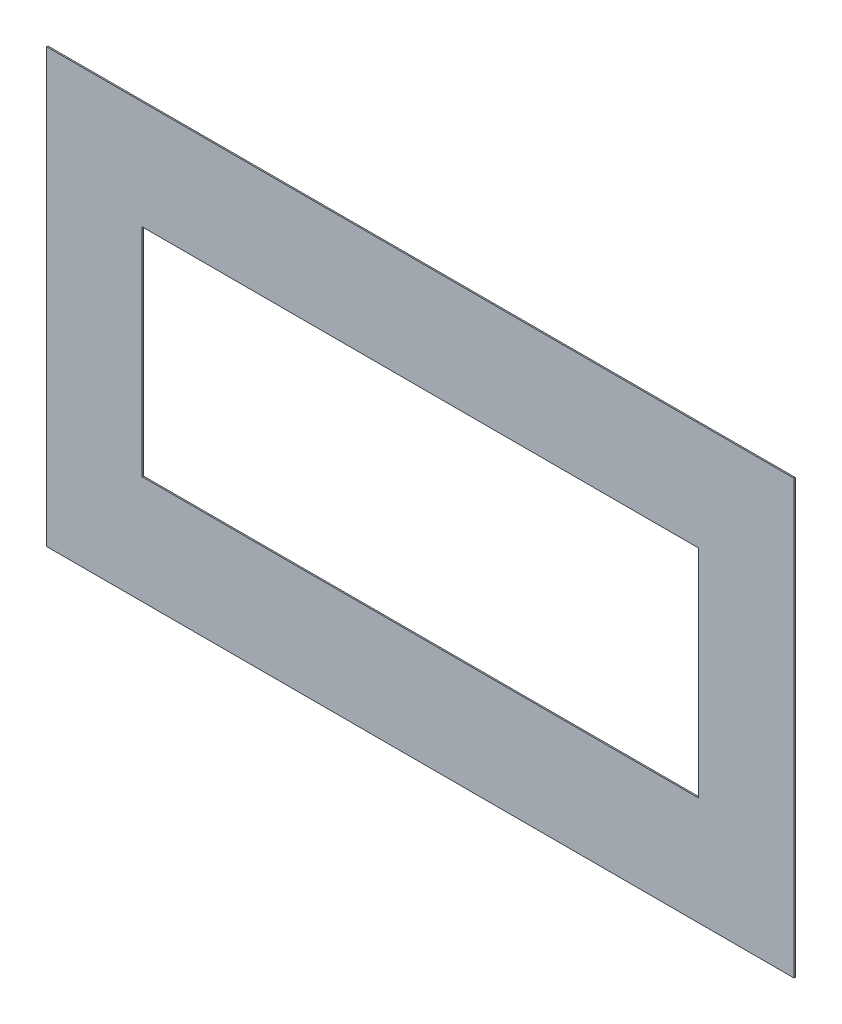
ISO-10303-21;
HEADER;
FILE_DESCRIPTION(('STEP AP214'),'2;1');
FILE_NAME('part.step','',(''),(''),'','','');
FILE_SCHEMA(('AUTOMOTIVE_DESIGN { 1 0 10303 214 1 1 1 1 }'));
ENDSEC;
DATA;
#1=APPLICATION_CONTEXT('core data for automotive mechanical design processes');
#2=APPLICATION_PROTOCOL_DEFINITION('international standard','automotive_design',2000,#1);
#3=PRODUCT_CONTEXT('',#1,'mechanical');
#4=PRODUCT('Part','Part','',(#3));
#5=PRODUCT_RELATED_PRODUCT_CATEGORY('part','',(#4));
#6=PRODUCT_DEFINITION_FORMATION('','',#4);
#7=PRODUCT_DEFINITION_CONTEXT('part definition',#1,'design');
#8=PRODUCT_DEFINITION('design','',#6,#7);
#9=PRODUCT_DEFINITION_SHAPE('','',#8);
#10=(LENGTH_UNIT() NAMED_UNIT(*) SI_UNIT(.MILLI.,.METRE.));
#11=(NAMED_UNIT(*) PLANE_ANGLE_UNIT() SI_UNIT($,.RADIAN.));
#12=(NAMED_UNIT(*) SI_UNIT($,.STERADIAN.) SOLID_ANGLE_UNIT());
#13=UNCERTAINTY_MEASURE_WITH_UNIT(LENGTH_MEASURE(1.E-05),#10,'distance_accuracy_value','');
#14=(GEOMETRIC_REPRESENTATION_CONTEXT(3) GLOBAL_UNCERTAINTY_ASSIGNED_CONTEXT((#13)) GLOBAL_UNIT_ASSIGNED_CONTEXT((#10,
#11,#12)) REPRESENTATION_CONTEXT('',''));
#15=CARTESIAN_POINT('',(0.,0.,0.));
#16=DIRECTION('',(0.,0.,1.));
#17=DIRECTION('',(1.,0.,0.));
#18=AXIS2_PLACEMENT_3D('',#15,#16,#17);
#19=CARTESIAN_POINT('',(-685.8,-266.7,0.));
#20=DIRECTION('',(-1.,0.,0.));
#21=DIRECTION('',(0.,0.,1.));
#22=AXIS2_PLACEMENT_3D('',#19,#20,#21);
#23=PLANE('',#22);
#24=DIRECTION('',(0.,-1.,0.));
#25=VECTOR('',#24,1.);
#26=CARTESIAN_POINT('',(-685.8,266.7,-3.175));
#27=LINE('',#26,#25);
#28=CARTESIAN_POINT('',(-685.8,266.7,-3.175));
#29=VERTEX_POINT('',#28);
#30=CARTESIAN_POINT('',(-685.8,-266.7,-3.175));
#31=VERTEX_POINT('',#30);
#32=EDGE_CURVE('E34',#29,#31,#27,.T.);
#33=ORIENTED_EDGE('',*,*,#32,.F.);
#34=DIRECTION('',(0.,0.,-1.));
#35=VECTOR('',#34,1.);
#36=CARTESIAN_POINT('',(-685.8,266.7,0.));
#37=LINE('',#36,#35);
#38=CARTESIAN_POINT('',(-685.8,266.7,0.));
#39=VERTEX_POINT('',#38);
#40=EDGE_CURVE('E114',#39,#29,#37,.T.);
#41=ORIENTED_EDGE('',*,*,#40,.F.);
#42=DIRECTION('',(0.,1.,0.));
#43=VECTOR('',#42,1.);
#44=CARTESIAN_POINT('',(-685.8,-266.7,0.));
#45=LINE('',#44,#43);
#46=CARTESIAN_POINT('',(-685.8,-266.7,0.));
#47=VERTEX_POINT('',#46);
#48=EDGE_CURVE('E174',#47,#39,#45,.T.);
#49=ORIENTED_EDGE('',*,*,#48,.F.);
#50=DIRECTION('',(0.,0.,-1.));
#51=VECTOR('',#50,1.);
#52=CARTESIAN_POINT('',(-685.8,-266.7,0.));
#53=LINE('',#52,#51);
#54=EDGE_CURVE('E10',#47,#31,#53,.T.);
#55=ORIENTED_EDGE('',*,*,#54,.T.);
#56=EDGE_LOOP('',(#33,#41,#49,#55));
#57=FACE_BOUND('',#56,.T.);
#58=ADVANCED_FACE('F16',(#57),#23,.F.);
#59=CARTESIAN_POINT('',(685.8,-266.7,0.));
#60=DIRECTION('',(0.,-1.,0.));
#61=DIRECTION('',(0.,0.,-1.));
#62=AXIS2_PLACEMENT_3D('',#59,#60,#61);
#63=PLANE('',#62);
#64=DIRECTION('',(1.,0.,0.));
#65=VECTOR('',#64,1.);
#66=CARTESIAN_POINT('',(-685.8,-266.7,-3.175));
#67=LINE('',#66,#65);
#68=CARTESIAN_POINT('',(685.8,-266.7,-3.175));
#69=VERTEX_POINT('',#68);
#70=EDGE_CURVE('E128',#31,#69,#67,.T.);
#71=ORIENTED_EDGE('',*,*,#70,.F.);
#72=ORIENTED_EDGE('',*,*,#54,.F.);
#73=DIRECTION('',(-1.,0.,0.));
#74=VECTOR('',#73,1.);
#75=CARTESIAN_POINT('',(685.8,-266.7,0.));
#76=LINE('',#75,#74);
#77=CARTESIAN_POINT('',(685.8,-266.7,0.));
#78=VERTEX_POINT('',#77);
#79=EDGE_CURVE('E176',#78,#47,#76,.T.);
#80=ORIENTED_EDGE('',*,*,#79,.F.);
#81=DIRECTION('',(0.,0.,-1.));
#82=VECTOR('',#81,1.);
#83=CARTESIAN_POINT('',(685.8,-266.7,0.));
#84=LINE('',#83,#82);
#85=EDGE_CURVE('E26',#78,#69,#84,.T.);
#86=ORIENTED_EDGE('',*,*,#85,.T.);
#87=EDGE_LOOP('',(#71,#72,#80,#86));
#88=FACE_BOUND('',#87,.T.);
#89=ADVANCED_FACE('F145',(#88),#63,.F.);
#90=CARTESIAN_POINT('',(685.8,266.7,0.));
#91=DIRECTION('',(1.,0.,0.));
#92=DIRECTION('',(0.,0.,-1.));
#93=AXIS2_PLACEMENT_3D('',#90,#91,#92);
#94=PLANE('',#93);
#95=DIRECTION('',(0.,1.,0.));
#96=VECTOR('',#95,1.);
#97=CARTESIAN_POINT('',(685.8,-266.7,-3.175));
#98=LINE('',#97,#96);
#99=CARTESIAN_POINT('',(685.8,266.7,-3.175));
#100=VERTEX_POINT('',#99);
#101=EDGE_CURVE('E109',#69,#100,#98,.T.);
#102=ORIENTED_EDGE('',*,*,#101,.F.);
#103=ORIENTED_EDGE('',*,*,#85,.F.);
#104=DIRECTION('',(0.,-1.,0.));
#105=VECTOR('',#104,1.);
#106=CARTESIAN_POINT('',(685.8,266.7,0.));
#107=LINE('',#106,#105);
#108=CARTESIAN_POINT('',(685.8,266.7,0.));
#109=VERTEX_POINT('',#108);
#110=EDGE_CURVE('E127',#109,#78,#107,.T.);
#111=ORIENTED_EDGE('',*,*,#110,.F.);
#112=DIRECTION('',(0.,0.,-1.));
#113=VECTOR('',#112,1.);
#114=CARTESIAN_POINT('',(685.8,266.7,0.));
#115=LINE('',#114,#113);
#116=EDGE_CURVE('E117',#109,#100,#115,.T.);
#117=ORIENTED_EDGE('',*,*,#116,.T.);
#118=EDGE_LOOP('',(#102,#103,#111,#117));
#119=FACE_BOUND('',#118,.T.);
#120=ADVANCED_FACE('F150',(#119),#94,.F.);
#121=CARTESIAN_POINT('',(-685.8,266.7,0.));
#122=DIRECTION('',(0.,1.,0.));
#123=DIRECTION('',(0.,0.,1.));
#124=AXIS2_PLACEMENT_3D('',#121,#122,#123);
#125=PLANE('',#124);
#126=DIRECTION('',(-1.,0.,0.));
#127=VECTOR('',#126,1.);
#128=CARTESIAN_POINT('',(685.8,266.7,-3.175));
#129=LINE('',#128,#127);
#130=EDGE_CURVE('E164',#100,#29,#129,.T.);
#131=ORIENTED_EDGE('',*,*,#130,.F.);
#132=ORIENTED_EDGE('',*,*,#116,.F.);
#133=DIRECTION('',(1.,0.,0.));
#134=VECTOR('',#133,1.);
#135=CARTESIAN_POINT('',(-685.8,266.7,0.));
#136=LINE('',#135,#134);
#137=EDGE_CURVE('E173',#39,#109,#136,.T.);
#138=ORIENTED_EDGE('',*,*,#137,.F.);
#139=ORIENTED_EDGE('',*,*,#40,.T.);
#140=EDGE_LOOP('',(#131,#132,#138,#139));
#141=FACE_BOUND('',#140,.T.);
#142=ADVANCED_FACE('F142',(#141),#125,.F.);
#143=CARTESIAN_POINT('',(920.75,533.4,0.));
#144=DIRECTION('',(1.,0.,0.));
#145=DIRECTION('',(0.,0.,-1.));
#146=AXIS2_PLACEMENT_3D('',#143,#144,#145);
#147=PLANE('',#146);
#148=DIRECTION('',(0.,1.,0.));
#149=VECTOR('',#148,1.);
#150=CARTESIAN_POINT('',(920.75,-533.4,0.));
#151=LINE('',#150,#149);
#152=CARTESIAN_POINT('',(920.75,-533.4,0.));
#153=VERTEX_POINT('',#152);
#154=CARTESIAN_POINT('',(920.75,533.4,0.));
#155=VERTEX_POINT('',#154);
#156=EDGE_CURVE('E113',#153,#155,#151,.T.);
#157=ORIENTED_EDGE('',*,*,#156,.F.);
#158=DIRECTION('',(0.,0.,-1.));
#159=VECTOR('',#158,1.);
#160=CARTESIAN_POINT('',(920.75,-533.4,0.));
#161=LINE('',#160,#159);
#162=CARTESIAN_POINT('',(920.75,-533.4,-3.175));
#163=VERTEX_POINT('',#162);
#164=EDGE_CURVE('E111',#153,#163,#161,.T.);
#165=ORIENTED_EDGE('',*,*,#164,.T.);
#166=DIRECTION('',(0.,-1.,0.));
#167=VECTOR('',#166,1.);
#168=CARTESIAN_POINT('',(920.75,533.4,-3.175));
#169=LINE('',#168,#167);
#170=CARTESIAN_POINT('',(920.75,533.4,-3.175));
#171=VERTEX_POINT('',#170);
#172=EDGE_CURVE('E104',#171,#163,#169,.T.);
#173=ORIENTED_EDGE('',*,*,#172,.F.);
#174=DIRECTION('',(0.,0.,-1.));
#175=VECTOR('',#174,1.);
#176=CARTESIAN_POINT('',(920.75,533.4,0.));
#177=LINE('',#176,#175);
#178=EDGE_CURVE('E115',#155,#171,#177,.T.);
#179=ORIENTED_EDGE('',*,*,#178,.F.);
#180=EDGE_LOOP('',(#157,#165,#173,#179));
#181=FACE_BOUND('',#180,.T.);
#182=ADVANCED_FACE('F112',(#181),#147,.T.);
#183=CARTESIAN_POINT('',(-920.75,533.4,0.));
#184=DIRECTION('',(0.,1.,0.));
#185=DIRECTION('',(0.,0.,1.));
#186=AXIS2_PLACEMENT_3D('',#183,#184,#185);
#187=PLANE('',#186);
#188=DIRECTION('',(-1.,0.,0.));
#189=VECTOR('',#188,1.);
#190=CARTESIAN_POINT('',(920.75,533.4,0.));
#191=LINE('',#190,#189);
#192=CARTESIAN_POINT('',(-920.75,533.4,0.));
#193=VERTEX_POINT('',#192);
#194=EDGE_CURVE('E123',#155,#193,#191,.T.);
#195=ORIENTED_EDGE('',*,*,#194,.F.);
#196=ORIENTED_EDGE('',*,*,#178,.T.);
#197=DIRECTION('',(1.,0.,0.));
#198=VECTOR('',#197,1.);
#199=CARTESIAN_POINT('',(-920.75,533.4,-3.175));
#200=LINE('',#199,#198);
#201=CARTESIAN_POINT('',(-920.75,533.4,-3.175));
#202=VERTEX_POINT('',#201);
#203=EDGE_CURVE('E94',#202,#171,#200,.T.);
#204=ORIENTED_EDGE('',*,*,#203,.F.);
#205=DIRECTION('',(0.,0.,-1.));
#206=VECTOR('',#205,1.);
#207=CARTESIAN_POINT('',(-920.75,533.4,0.));
#208=LINE('',#207,#206);
#209=EDGE_CURVE('E90',#193,#202,#208,.T.);
#210=ORIENTED_EDGE('',*,*,#209,.F.);
#211=EDGE_LOOP('',(#195,#196,#204,#210));
#212=FACE_BOUND('',#211,.T.);
#213=ADVANCED_FACE('F133',(#212),#187,.T.);
#214=CARTESIAN_POINT('',(-920.75,-533.4,0.));
#215=DIRECTION('',(-1.,0.,0.));
#216=DIRECTION('',(0.,0.,1.));
#217=AXIS2_PLACEMENT_3D('',#214,#215,#216);
#218=PLANE('',#217);
#219=DIRECTION('',(0.,-1.,0.));
#220=VECTOR('',#219,1.);
#221=CARTESIAN_POINT('',(-920.75,533.4,0.));
#222=LINE('',#221,#220);
#223=CARTESIAN_POINT('',(-920.75,-533.4,0.));
#224=VERTEX_POINT('',#223);
#225=EDGE_CURVE('E78',#193,#224,#222,.T.);
#226=ORIENTED_EDGE('',*,*,#225,.F.);
#227=ORIENTED_EDGE('',*,*,#209,.T.);
#228=DIRECTION('',(0.,1.,0.));
#229=VECTOR('',#228,1.);
#230=CARTESIAN_POINT('',(-920.75,-533.4,-3.175));
#231=LINE('',#230,#229);
#232=CARTESIAN_POINT('',(-920.75,-533.4,-3.175));
#233=VERTEX_POINT('',#232);
#234=EDGE_CURVE('E84',#233,#202,#231,.T.);
#235=ORIENTED_EDGE('',*,*,#234,.F.);
#236=DIRECTION('',(0.,0.,-1.));
#237=VECTOR('',#236,1.);
#238=CARTESIAN_POINT('',(-920.75,-533.4,0.));
#239=LINE('',#238,#237);
#240=EDGE_CURVE('E87',#224,#233,#239,.T.);
#241=ORIENTED_EDGE('',*,*,#240,.F.);
#242=EDGE_LOOP('',(#226,#227,#235,#241));
#243=FACE_BOUND('',#242,.T.);
#244=ADVANCED_FACE('F86',(#243),#218,.T.);
#245=CARTESIAN_POINT('',(920.75,-533.4,0.));
#246=DIRECTION('',(0.,-1.,0.));
#247=DIRECTION('',(0.,0.,-1.));
#248=AXIS2_PLACEMENT_3D('',#245,#246,#247);
#249=PLANE('',#248);
#250=DIRECTION('',(1.,0.,0.));
#251=VECTOR('',#250,1.);
#252=CARTESIAN_POINT('',(-920.75,-533.4,0.));
#253=LINE('',#252,#251);
#254=EDGE_CURVE('E100',#224,#153,#253,.T.);
#255=ORIENTED_EDGE('',*,*,#254,.F.);
#256=ORIENTED_EDGE('',*,*,#240,.T.);
#257=DIRECTION('',(-1.,0.,0.));
#258=VECTOR('',#257,1.);
#259=CARTESIAN_POINT('',(920.75,-533.4,-3.175));
#260=LINE('',#259,#258);
#261=EDGE_CURVE('E20',#163,#233,#260,.T.);
#262=ORIENTED_EDGE('',*,*,#261,.F.);
#263=ORIENTED_EDGE('',*,*,#164,.F.);
#264=EDGE_LOOP('',(#255,#256,#262,#263));
#265=FACE_BOUND('',#264,.T.);
#266=ADVANCED_FACE('F98',(#265),#249,.T.);
#267=CARTESIAN_POINT('',(0.,0.,-3.175));
#268=DIRECTION('',(0.,0.,1.));
#269=DIRECTION('',(1.,0.,0.));
#270=AXIS2_PLACEMENT_3D('',#267,#268,#269);
#271=PLANE('',#270);
#272=ORIENTED_EDGE('',*,*,#261,.T.);
#273=ORIENTED_EDGE('',*,*,#234,.T.);
#274=ORIENTED_EDGE('',*,*,#203,.T.);
#275=ORIENTED_EDGE('',*,*,#172,.T.);
#276=EDGE_LOOP('',(#272,#273,#274,#275));
#277=FACE_BOUND('',#276,.T.);
#278=ORIENTED_EDGE('',*,*,#101,.T.);
#279=ORIENTED_EDGE('',*,*,#130,.T.);
#280=ORIENTED_EDGE('',*,*,#32,.T.);
#281=ORIENTED_EDGE('',*,*,#70,.T.);
#282=EDGE_LOOP('',(#278,#279,#280,#281));
#283=FACE_BOUND('',#282,.T.);
#284=ADVANCED_FACE('F102',(#277,#283),#271,.F.);
#285=CARTESIAN_POINT('',(0.,0.,0.));
#286=DIRECTION('',(0.,0.,1.));
#287=DIRECTION('',(1.,0.,0.));
#288=AXIS2_PLACEMENT_3D('',#285,#286,#287);
#289=PLANE('',#288);
#290=ORIENTED_EDGE('',*,*,#254,.T.);
#291=ORIENTED_EDGE('',*,*,#156,.T.);
#292=ORIENTED_EDGE('',*,*,#194,.T.);
#293=ORIENTED_EDGE('',*,*,#225,.T.);
#294=EDGE_LOOP('',(#290,#291,#292,#293));
#295=FACE_BOUND('',#294,.T.);
#296=ORIENTED_EDGE('',*,*,#110,.T.);
#297=ORIENTED_EDGE('',*,*,#79,.T.);
#298=ORIENTED_EDGE('',*,*,#48,.T.);
#299=ORIENTED_EDGE('',*,*,#137,.T.);
#300=EDGE_LOOP('',(#296,#297,#298,#299));
#301=FACE_BOUND('',#300,.T.);
#302=ADVANCED_FACE('F18',(#295,#301),#289,.T.);
#303=CLOSED_SHELL('',(#58,#89,#120,#142,#182,#213,#244,#266,#284,#302));
#304=MANIFOLD_SOLID_BREP('B1',#303);
#305=ADVANCED_BREP_SHAPE_REPRESENTATION('',(#18,#304),#14);
#306=SHAPE_DEFINITION_REPRESENTATION(#9,#305);
ENDSEC;
END-ISO-10303-21;
